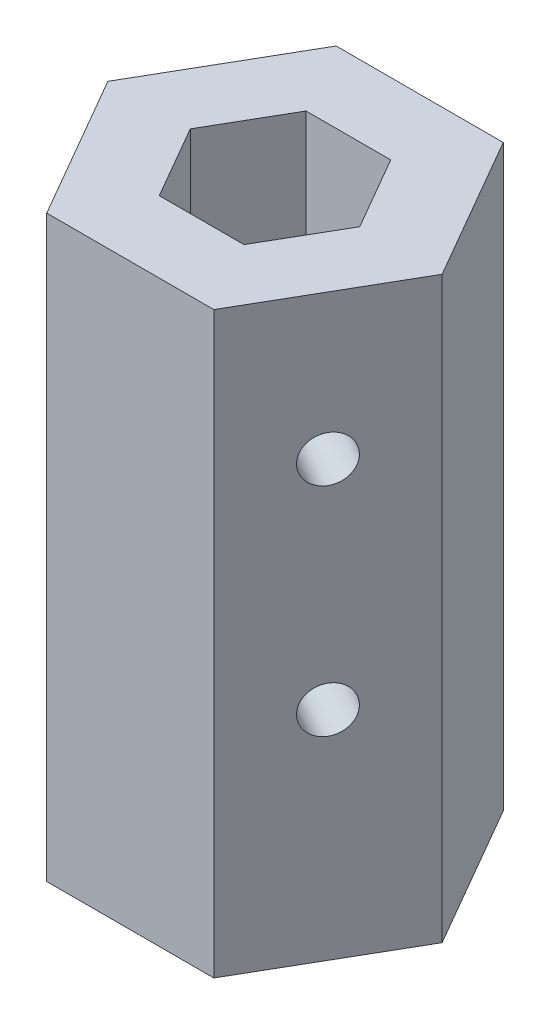
ISO-10303-21;
HEADER;
FILE_DESCRIPTION(('STEP AP214'),'2;1');
FILE_NAME('part.step','',(''),(''),'','','');
FILE_SCHEMA(('AUTOMOTIVE_DESIGN { 1 0 10303 214 1 1 1 1 }'));
ENDSEC;
DATA;
#1=APPLICATION_CONTEXT('core data for automotive mechanical design processes');
#2=APPLICATION_PROTOCOL_DEFINITION('international standard','automotive_design',2000,#1);
#3=PRODUCT_CONTEXT('',#1,'mechanical');
#4=PRODUCT('Part','Part','',(#3));
#5=PRODUCT_RELATED_PRODUCT_CATEGORY('part','',(#4));
#6=PRODUCT_DEFINITION_FORMATION('','',#4);
#7=PRODUCT_DEFINITION_CONTEXT('part definition',#1,'design');
#8=PRODUCT_DEFINITION('design','',#6,#7);
#9=PRODUCT_DEFINITION_SHAPE('','',#8);
#10=(LENGTH_UNIT() NAMED_UNIT(*) SI_UNIT(.MILLI.,.METRE.));
#11=(NAMED_UNIT(*) PLANE_ANGLE_UNIT() SI_UNIT($,.RADIAN.));
#12=(NAMED_UNIT(*) SI_UNIT($,.STERADIAN.) SOLID_ANGLE_UNIT());
#13=UNCERTAINTY_MEASURE_WITH_UNIT(LENGTH_MEASURE(1.E-05),#10,'distance_accuracy_value','');
#14=(GEOMETRIC_REPRESENTATION_CONTEXT(3) GLOBAL_UNCERTAINTY_ASSIGNED_CONTEXT((#13)) GLOBAL_UNIT_ASSIGNED_CONTEXT((#10,
#11,#12)) REPRESENTATION_CONTEXT('',''));
#15=CARTESIAN_POINT('',(0.,0.,0.));
#16=DIRECTION('',(0.,0.,1.));
#17=DIRECTION('',(1.,0.,0.));
#18=AXIS2_PLACEMENT_3D('',#15,#16,#17);
#19=CARTESIAN_POINT('',(0.,50.8,0.));
#20=DIRECTION('',(0.,1.,0.));
#21=DIRECTION('',(0.,0.,1.));
#22=AXIS2_PLACEMENT_3D('',#19,#20,#21);
#23=PLANE('',#22);
#24=DIRECTION('',(-0.5,0.,-0.866025403784438));
#25=VECTOR('',#24,1.);
#26=CARTESIAN_POINT('',(14.6646968374165,50.8,0.));
#27=LINE('',#26,#25);
#28=CARTESIAN_POINT('',(14.6646968374165,50.8,0.));
#29=VERTEX_POINT('',#28);
#30=CARTESIAN_POINT('',(7.33234841870825,50.8,-12.7));
#31=VERTEX_POINT('',#30);
#32=EDGE_CURVE('E203',#29,#31,#27,.T.);
#33=ORIENTED_EDGE('',*,*,#32,.T.);
#34=DIRECTION('',(-1.,0.,0.));
#35=VECTOR('',#34,1.);
#36=CARTESIAN_POINT('',(7.33234841870825,50.8,-12.7));
#37=LINE('',#36,#35);
#38=CARTESIAN_POINT('',(-7.33234841870825,50.8,-12.7));
#39=VERTEX_POINT('',#38);
#40=EDGE_CURVE('E207',#31,#39,#37,.T.);
#41=ORIENTED_EDGE('',*,*,#40,.T.);
#42=DIRECTION('',(-0.5,0.,0.866025403784439));
#43=VECTOR('',#42,1.);
#44=CARTESIAN_POINT('',(-7.33234841870825,50.8,-12.7));
#45=LINE('',#44,#43);
#46=CARTESIAN_POINT('',(-14.6646968374165,50.8,0.));
#47=VERTEX_POINT('',#46);
#48=EDGE_CURVE('E211',#39,#47,#45,.T.);
#49=ORIENTED_EDGE('',*,*,#48,.T.);
#50=DIRECTION('',(0.5,0.,0.866025403784439));
#51=VECTOR('',#50,1.);
#52=CARTESIAN_POINT('',(-14.6646968374165,50.8,0.));
#53=LINE('',#52,#51);
#54=CARTESIAN_POINT('',(-7.33234841870824,50.8,12.7));
#55=VERTEX_POINT('',#54);
#56=EDGE_CURVE('E214',#47,#55,#53,.T.);
#57=ORIENTED_EDGE('',*,*,#56,.T.);
#58=DIRECTION('',(1.,0.,0.));
#59=VECTOR('',#58,1.);
#60=CARTESIAN_POINT('',(-7.33234841870824,50.8,12.7));
#61=LINE('',#60,#59);
#62=CARTESIAN_POINT('',(7.33234841870825,50.8,12.7));
#63=VERTEX_POINT('',#62);
#64=EDGE_CURVE('E217',#55,#63,#61,.T.);
#65=ORIENTED_EDGE('',*,*,#64,.T.);
#66=DIRECTION('',(0.5,0.,-0.866025403784439));
#67=VECTOR('',#66,1.);
#68=CARTESIAN_POINT('',(7.33234841870825,50.8,12.7));
#69=LINE('',#68,#67);
#70=EDGE_CURVE('E220',#63,#29,#69,.T.);
#71=ORIENTED_EDGE('',*,*,#70,.T.);
#72=EDGE_LOOP('',(#33,#41,#49,#57,#65,#71));
#73=FACE_BOUND('',#72,.T.);
#74=DIRECTION('',(-1.,0.,0.));
#75=VECTOR('',#74,1.);
#76=CARTESIAN_POINT('',(3.71750064828508,50.8,-6.4389));
#77=LINE('',#76,#75);
#78=CARTESIAN_POINT('',(3.71750064828508,50.8,-6.4389));
#79=VERTEX_POINT('',#78);
#80=CARTESIAN_POINT('',(-3.71750064828508,50.8,-6.4389));
#81=VERTEX_POINT('',#80);
#82=EDGE_CURVE('E173',#79,#81,#77,.T.);
#83=ORIENTED_EDGE('',*,*,#82,.F.);
#84=DIRECTION('',(-0.5,0.,-0.866025403784438));
#85=VECTOR('',#84,1.);
#86=CARTESIAN_POINT('',(7.43500129657016,50.8,0.));
#87=LINE('',#86,#85);
#88=CARTESIAN_POINT('',(7.43500129657016,50.8,0.));
#89=VERTEX_POINT('',#88);
#90=EDGE_CURVE('E170',#89,#79,#87,.T.);
#91=ORIENTED_EDGE('',*,*,#90,.F.);
#92=DIRECTION('',(0.5,0.,-0.866025403784439));
#93=VECTOR('',#92,1.);
#94=CARTESIAN_POINT('',(3.71750064828508,50.8,6.4389));
#95=LINE('',#94,#93);
#96=CARTESIAN_POINT('',(3.71750064828508,50.8,6.4389));
#97=VERTEX_POINT('',#96);
#98=EDGE_CURVE('E140',#97,#89,#95,.T.);
#99=ORIENTED_EDGE('',*,*,#98,.F.);
#100=DIRECTION('',(1.,0.,0.));
#101=VECTOR('',#100,1.);
#102=CARTESIAN_POINT('',(-3.71750064828508,50.8,6.4389));
#103=LINE('',#102,#101);
#104=CARTESIAN_POINT('',(-3.71750064828508,50.8,6.4389));
#105=VERTEX_POINT('',#104);
#106=EDGE_CURVE('E182',#105,#97,#103,.T.);
#107=ORIENTED_EDGE('',*,*,#106,.F.);
#108=DIRECTION('',(0.5,0.,0.866025403784438));
#109=VECTOR('',#108,1.);
#110=CARTESIAN_POINT('',(-7.43500129657016,50.8,0.));
#111=LINE('',#110,#109);
#112=CARTESIAN_POINT('',(-7.43500129657016,50.8,0.));
#113=VERTEX_POINT('',#112);
#114=EDGE_CURVE('E179',#113,#105,#111,.T.);
#115=ORIENTED_EDGE('',*,*,#114,.F.);
#116=DIRECTION('',(-0.5,0.,0.866025403784439));
#117=VECTOR('',#116,1.);
#118=CARTESIAN_POINT('',(-3.71750064828508,50.8,-6.4389));
#119=LINE('',#118,#117);
#120=EDGE_CURVE('E176',#81,#113,#119,.T.);
#121=ORIENTED_EDGE('',*,*,#120,.F.);
#122=EDGE_LOOP('',(#83,#91,#99,#107,#115,#121));
#123=FACE_BOUND('',#122,.T.);
#124=ADVANCED_FACE('F39',(#73,#123),#23,.T.);
#125=CARTESIAN_POINT('',(0.,0.,0.));
#126=DIRECTION('',(0.,1.,0.));
#127=DIRECTION('',(0.,0.,1.));
#128=AXIS2_PLACEMENT_3D('',#125,#126,#127);
#129=PLANE('',#128);
#130=DIRECTION('',(-0.5,0.,-0.866025403784438));
#131=VECTOR('',#130,1.);
#132=CARTESIAN_POINT('',(14.6646968374165,0.,0.));
#133=LINE('',#132,#131);
#134=CARTESIAN_POINT('',(14.6646968374165,0.,0.));
#135=VERTEX_POINT('',#134);
#136=CARTESIAN_POINT('',(7.33234841870825,0.,-12.7));
#137=VERTEX_POINT('',#136);
#138=EDGE_CURVE('E202',#135,#137,#133,.T.);
#139=ORIENTED_EDGE('',*,*,#138,.F.);
#140=DIRECTION('',(0.5,0.,-0.866025403784439));
#141=VECTOR('',#140,1.);
#142=CARTESIAN_POINT('',(7.33234841870825,0.,12.7));
#143=LINE('',#142,#141);
#144=CARTESIAN_POINT('',(7.33234841870825,0.,12.7));
#145=VERTEX_POINT('',#144);
#146=EDGE_CURVE('E208',#145,#135,#143,.T.);
#147=ORIENTED_EDGE('',*,*,#146,.F.);
#148=DIRECTION('',(1.,0.,0.));
#149=VECTOR('',#148,1.);
#150=CARTESIAN_POINT('',(-7.33234841870824,0.,12.7));
#151=LINE('',#150,#149);
#152=CARTESIAN_POINT('',(-7.33234841870824,0.,12.7));
#153=VERTEX_POINT('',#152);
#154=EDGE_CURVE('E236',#153,#145,#151,.T.);
#155=ORIENTED_EDGE('',*,*,#154,.F.);
#156=DIRECTION('',(0.5,0.,0.866025403784439));
#157=VECTOR('',#156,1.);
#158=CARTESIAN_POINT('',(-14.6646968374165,0.,0.));
#159=LINE('',#158,#157);
#160=CARTESIAN_POINT('',(-14.6646968374165,0.,0.));
#161=VERTEX_POINT('',#160);
#162=EDGE_CURVE('E233',#161,#153,#159,.T.);
#163=ORIENTED_EDGE('',*,*,#162,.F.);
#164=DIRECTION('',(-0.5,0.,0.866025403784439));
#165=VECTOR('',#164,1.);
#166=CARTESIAN_POINT('',(-7.33234841870825,0.,-12.7));
#167=LINE('',#166,#165);
#168=CARTESIAN_POINT('',(-7.33234841870825,0.,-12.7));
#169=VERTEX_POINT('',#168);
#170=EDGE_CURVE('E230',#169,#161,#167,.T.);
#171=ORIENTED_EDGE('',*,*,#170,.F.);
#172=DIRECTION('',(-1.,0.,0.));
#173=VECTOR('',#172,1.);
#174=CARTESIAN_POINT('',(7.33234841870825,0.,-12.7));
#175=LINE('',#174,#173);
#176=EDGE_CURVE('E227',#137,#169,#175,.T.);
#177=ORIENTED_EDGE('',*,*,#176,.F.);
#178=EDGE_LOOP('',(#139,#147,#155,#163,#171,#177));
#179=FACE_BOUND('',#178,.T.);
#180=ADVANCED_FACE('F328',(#179),#129,.F.);
#181=CARTESIAN_POINT('',(14.6646968374165,50.8,0.));
#182=DIRECTION('',(-0.866025403784438,0.,0.5));
#183=DIRECTION('',(0.5,0.,0.866025403784439));
#184=AXIS2_PLACEMENT_3D('',#181,#182,#183);
#185=PLANE('',#184);
#186=ORIENTED_EDGE('',*,*,#138,.T.);
#187=DIRECTION('',(0.,-1.,0.));
#188=VECTOR('',#187,1.);
#189=CARTESIAN_POINT('',(7.33234841870825,50.8,-12.7));
#190=LINE('',#189,#188);
#191=EDGE_CURVE('E11',#31,#137,#190,.T.);
#192=ORIENTED_EDGE('',*,*,#191,.F.);
#193=ORIENTED_EDGE('',*,*,#32,.F.);
#194=DIRECTION('',(0.,-1.,0.));
#195=VECTOR('',#194,1.);
#196=CARTESIAN_POINT('',(14.6646968374165,50.8,0.));
#197=LINE('',#196,#195);
#198=EDGE_CURVE('E223',#29,#135,#197,.T.);
#199=ORIENTED_EDGE('',*,*,#198,.T.);
#200=EDGE_LOOP('',(#186,#192,#193,#199));
#201=FACE_BOUND('',#200,.T.);
#202=ADVANCED_FACE('F41',(#201),#185,.F.);
#203=CARTESIAN_POINT('',(7.33234841870825,50.8,-12.7));
#204=DIRECTION('',(0.,0.,1.));
#205=DIRECTION('',(1.,0.,0.));
#206=AXIS2_PLACEMENT_3D('',#203,#204,#205);
#207=PLANE('',#206);
#208=ORIENTED_EDGE('',*,*,#176,.T.);
#209=DIRECTION('',(0.,-1.,0.));
#210=VECTOR('',#209,1.);
#211=CARTESIAN_POINT('',(-7.33234841870825,50.8,-12.7));
#212=LINE('',#211,#210);
#213=EDGE_CURVE('E49',#39,#169,#212,.T.);
#214=ORIENTED_EDGE('',*,*,#213,.F.);
#215=ORIENTED_EDGE('',*,*,#40,.F.);
#216=ORIENTED_EDGE('',*,*,#191,.T.);
#217=EDGE_LOOP('',(#208,#214,#215,#216));
#218=FACE_BOUND('',#217,.T.);
#219=ADVANCED_FACE('F314',(#218),#207,.F.);
#220=CARTESIAN_POINT('',(-7.33234841870825,50.8,-12.7));
#221=DIRECTION('',(0.866025403784439,0.,0.5));
#222=DIRECTION('',(0.5,0.,-0.866025403784439));
#223=AXIS2_PLACEMENT_3D('',#220,#221,#222);
#224=PLANE('',#223);
#225=CARTESIAN_POINT('',(-10.9985226280624,38.1,-6.35));
#226=DIRECTION('',(0.866025403784439,0.,0.5));
#227=DIRECTION('',(0.5,0.,-0.866025403784439));
#228=AXIS2_PLACEMENT_3D('',#225,#226,#227);
#229=CIRCLE('',#228,2.6289);
#230=CARTESIAN_POINT('',(-9.68407262806237,38.1,-8.62669418400891));
#231=VERTEX_POINT('',#230);
#232=EDGE_CURVE('E274',#231,#231,#229,.T.);
#233=ORIENTED_EDGE('',*,*,#232,.T.);
#234=EDGE_LOOP('',(#233));
#235=FACE_BOUND('',#234,.T.);
#236=CARTESIAN_POINT('',(-10.9985226280624,19.05,-6.35));
#237=DIRECTION('',(0.866025403784439,0.,0.5));
#238=DIRECTION('',(0.5,0.,-0.866025403784439));
#239=AXIS2_PLACEMENT_3D('',#236,#237,#238);
#240=CIRCLE('',#239,2.6289);
#241=CARTESIAN_POINT('',(-9.68407262806237,19.05,-8.62669418400891));
#242=VERTEX_POINT('',#241);
#243=EDGE_CURVE('E279',#242,#242,#240,.T.);
#244=ORIENTED_EDGE('',*,*,#243,.T.);
#245=EDGE_LOOP('',(#244));
#246=FACE_BOUND('',#245,.T.);
#247=ORIENTED_EDGE('',*,*,#170,.T.);
#248=DIRECTION('',(0.,-1.,0.));
#249=VECTOR('',#248,1.);
#250=CARTESIAN_POINT('',(-14.6646968374165,50.8,0.));
#251=LINE('',#250,#249);
#252=EDGE_CURVE('E252',#47,#161,#251,.T.);
#253=ORIENTED_EDGE('',*,*,#252,.F.);
#254=ORIENTED_EDGE('',*,*,#48,.F.);
#255=ORIENTED_EDGE('',*,*,#213,.T.);
#256=EDGE_LOOP('',(#247,#253,#254,#255));
#257=FACE_BOUND('',#256,.T.);
#258=ADVANCED_FACE('F310',(#235,#246,#257),#224,.F.);
#259=CARTESIAN_POINT('',(-14.6646968374165,50.8,0.));
#260=DIRECTION('',(0.866025403784439,0.,-0.5));
#261=DIRECTION('',(-0.5,0.,-0.866025403784439));
#262=AXIS2_PLACEMENT_3D('',#259,#260,#261);
#263=PLANE('',#262);
#264=ORIENTED_EDGE('',*,*,#162,.T.);
#265=DIRECTION('',(0.,-1.,0.));
#266=VECTOR('',#265,1.);
#267=CARTESIAN_POINT('',(-7.33234841870824,50.8,12.7));
#268=LINE('',#267,#266);
#269=EDGE_CURVE('E248',#55,#153,#268,.T.);
#270=ORIENTED_EDGE('',*,*,#269,.F.);
#271=ORIENTED_EDGE('',*,*,#56,.F.);
#272=ORIENTED_EDGE('',*,*,#252,.T.);
#273=EDGE_LOOP('',(#264,#270,#271,#272));
#274=FACE_BOUND('',#273,.T.);
#275=ADVANCED_FACE('F313',(#274),#263,.F.);
#276=CARTESIAN_POINT('',(-7.33234841870824,50.8,12.7));
#277=DIRECTION('',(0.,0.,-1.));
#278=DIRECTION('',(-1.,0.,0.));
#279=AXIS2_PLACEMENT_3D('',#276,#277,#278);
#280=PLANE('',#279);
#281=ORIENTED_EDGE('',*,*,#154,.T.);
#282=DIRECTION('',(0.,-1.,0.));
#283=VECTOR('',#282,1.);
#284=CARTESIAN_POINT('',(7.33234841870825,50.8,12.7));
#285=LINE('',#284,#283);
#286=EDGE_CURVE('E244',#63,#145,#285,.T.);
#287=ORIENTED_EDGE('',*,*,#286,.F.);
#288=ORIENTED_EDGE('',*,*,#64,.F.);
#289=ORIENTED_EDGE('',*,*,#269,.T.);
#290=EDGE_LOOP('',(#281,#287,#288,#289));
#291=FACE_BOUND('',#290,.T.);
#292=ADVANCED_FACE('F332',(#291),#280,.F.);
#293=CARTESIAN_POINT('',(7.33234841870825,50.8,12.7));
#294=DIRECTION('',(-0.866025403784439,0.,-0.5));
#295=DIRECTION('',(-0.5,0.,0.866025403784439));
#296=AXIS2_PLACEMENT_3D('',#293,#294,#295);
#297=PLANE('',#296);
#298=CARTESIAN_POINT('',(10.9985226280624,19.05,6.35));
#299=DIRECTION('',(0.866025403784439,0.,0.5));
#300=DIRECTION('',(0.5,0.,-0.866025403784439));
#301=AXIS2_PLACEMENT_3D('',#298,#299,#300);
#302=CIRCLE('',#301,2.0193);
#303=CARTESIAN_POINT('',(12.0081726280624,19.05,4.60123490213809));
#304=VERTEX_POINT('',#303);
#305=EDGE_CURVE('E261',#304,#304,#302,.T.);
#306=ORIENTED_EDGE('',*,*,#305,.F.);
#307=EDGE_LOOP('',(#306));
#308=FACE_BOUND('',#307,.T.);
#309=CARTESIAN_POINT('',(10.9985226280624,38.1,6.35));
#310=DIRECTION('',(0.866025403784439,0.,0.5));
#311=DIRECTION('',(0.5,0.,-0.866025403784439));
#312=AXIS2_PLACEMENT_3D('',#309,#310,#311);
#313=CIRCLE('',#312,2.0193);
#314=CARTESIAN_POINT('',(12.0081726280624,38.1,4.60123490213809));
#315=VERTEX_POINT('',#314);
#316=EDGE_CURVE('E268',#315,#315,#313,.T.);
#317=ORIENTED_EDGE('',*,*,#316,.F.);
#318=EDGE_LOOP('',(#317));
#319=FACE_BOUND('',#318,.T.);
#320=ORIENTED_EDGE('',*,*,#146,.T.);
#321=ORIENTED_EDGE('',*,*,#198,.F.);
#322=ORIENTED_EDGE('',*,*,#70,.F.);
#323=ORIENTED_EDGE('',*,*,#286,.T.);
#324=EDGE_LOOP('',(#320,#321,#322,#323));
#325=FACE_BOUND('',#324,.T.);
#326=ADVANCED_FACE('F336',(#308,#319,#325),#297,.F.);
#327=CARTESIAN_POINT('',(7.43500129657016,50.8,0.));
#328=DIRECTION('',(-0.866025403784438,0.,0.5));
#329=DIRECTION('',(0.5,0.,0.866025403784439));
#330=AXIS2_PLACEMENT_3D('',#327,#328,#329);
#331=PLANE('',#330);
#332=DIRECTION('',(0.5,0.,0.866025403784439));
#333=VECTOR('',#332,1.);
#334=CARTESIAN_POINT('',(7.43500129657016,6.35,0.));
#335=LINE('',#334,#333);
#336=CARTESIAN_POINT('',(3.71750064828508,6.35,-6.4389));
#337=VERTEX_POINT('',#336);
#338=CARTESIAN_POINT('',(7.43500129657016,6.35,0.));
#339=VERTEX_POINT('',#338);
#340=EDGE_CURVE('E147',#337,#339,#335,.T.);
#341=ORIENTED_EDGE('',*,*,#340,.T.);
#342=DIRECTION('',(0.,-1.,0.));
#343=VECTOR('',#342,1.);
#344=CARTESIAN_POINT('',(7.43500129657016,50.8,0.));
#345=LINE('',#344,#343);
#346=EDGE_CURVE('E133',#89,#339,#345,.T.);
#347=ORIENTED_EDGE('',*,*,#346,.F.);
#348=ORIENTED_EDGE('',*,*,#90,.T.);
#349=DIRECTION('',(0.,-1.,0.));
#350=VECTOR('',#349,1.);
#351=CARTESIAN_POINT('',(3.71750064828508,50.8,-6.4389));
#352=LINE('',#351,#350);
#353=EDGE_CURVE('E149',#79,#337,#352,.T.);
#354=ORIENTED_EDGE('',*,*,#353,.T.);
#355=EDGE_LOOP('',(#341,#347,#348,#354));
#356=FACE_BOUND('',#355,.T.);
#357=ADVANCED_FACE('F148',(#356),#331,.T.);
#358=CARTESIAN_POINT('',(3.71750064828508,50.8,-6.4389));
#359=DIRECTION('',(0.,0.,1.));
#360=DIRECTION('',(1.,0.,0.));
#361=AXIS2_PLACEMENT_3D('',#358,#359,#360);
#362=PLANE('',#361);
#363=DIRECTION('',(1.,0.,0.));
#364=VECTOR('',#363,1.);
#365=CARTESIAN_POINT('',(3.71750064828508,6.35,-6.4389));
#366=LINE('',#365,#364);
#367=CARTESIAN_POINT('',(-3.71750064828508,6.35,-6.4389));
#368=VERTEX_POINT('',#367);
#369=EDGE_CURVE('E57',#368,#337,#366,.T.);
#370=ORIENTED_EDGE('',*,*,#369,.T.);
#371=ORIENTED_EDGE('',*,*,#353,.F.);
#372=ORIENTED_EDGE('',*,*,#82,.T.);
#373=DIRECTION('',(0.,-1.,0.));
#374=VECTOR('',#373,1.);
#375=CARTESIAN_POINT('',(-3.71750064828508,50.8,-6.4389));
#376=LINE('',#375,#374);
#377=EDGE_CURVE('E197',#81,#368,#376,.T.);
#378=ORIENTED_EDGE('',*,*,#377,.T.);
#379=EDGE_LOOP('',(#370,#371,#372,#378));
#380=FACE_BOUND('',#379,.T.);
#381=ADVANCED_FACE('F299',(#380),#362,.T.);
#382=CARTESIAN_POINT('',(-3.71750064828508,50.8,-6.4389));
#383=DIRECTION('',(0.866025403784439,0.,0.5));
#384=DIRECTION('',(0.5,0.,-0.866025403784439));
#385=AXIS2_PLACEMENT_3D('',#382,#383,#384);
#386=PLANE('',#385);
#387=CARTESIAN_POINT('',(-5.57625097242762,38.1,-3.21945));
#388=DIRECTION('',(0.866025403784439,0.,0.5));
#389=DIRECTION('',(0.5,0.,-0.866025403784439));
#390=AXIS2_PLACEMENT_3D('',#387,#388,#389);
#391=CIRCLE('',#390,2.6289);
#392=CARTESIAN_POINT('',(-4.26180097242762,38.1,-5.49614418400891));
#393=VERTEX_POINT('',#392);
#394=EDGE_CURVE('E283',#393,#393,#391,.T.);
#395=ORIENTED_EDGE('',*,*,#394,.F.);
#396=EDGE_LOOP('',(#395));
#397=FACE_BOUND('',#396,.T.);
#398=CARTESIAN_POINT('',(-5.57625097242762,19.05,-3.21945));
#399=DIRECTION('',(0.866025403784439,0.,0.5));
#400=DIRECTION('',(0.5,0.,-0.866025403784439));
#401=AXIS2_PLACEMENT_3D('',#398,#399,#400);
#402=CIRCLE('',#401,2.6289);
#403=CARTESIAN_POINT('',(-4.26180097242762,19.05,-5.49614418400891));
#404=VERTEX_POINT('',#403);
#405=EDGE_CURVE('E284',#404,#404,#402,.T.);
#406=ORIENTED_EDGE('',*,*,#405,.F.);
#407=EDGE_LOOP('',(#406));
#408=FACE_BOUND('',#407,.T.);
#409=DIRECTION('',(0.5,0.,-0.866025403784439));
#410=VECTOR('',#409,1.);
#411=CARTESIAN_POINT('',(-3.71750064828508,6.35,-6.4389));
#412=LINE('',#411,#410);
#413=CARTESIAN_POINT('',(-7.43500129657016,6.35,0.));
#414=VERTEX_POINT('',#413);
#415=EDGE_CURVE('E65',#414,#368,#412,.T.);
#416=ORIENTED_EDGE('',*,*,#415,.T.);
#417=ORIENTED_EDGE('',*,*,#377,.F.);
#418=ORIENTED_EDGE('',*,*,#120,.T.);
#419=DIRECTION('',(0.,-1.,0.));
#420=VECTOR('',#419,1.);
#421=CARTESIAN_POINT('',(-7.43500129657016,50.8,0.));
#422=LINE('',#421,#420);
#423=EDGE_CURVE('E194',#113,#414,#422,.T.);
#424=ORIENTED_EDGE('',*,*,#423,.T.);
#425=EDGE_LOOP('',(#416,#417,#418,#424));
#426=FACE_BOUND('',#425,.T.);
#427=ADVANCED_FACE('F295',(#397,#408,#426),#386,.T.);
#428=CARTESIAN_POINT('',(-7.43500129657016,50.8,0.));
#429=DIRECTION('',(0.866025403784438,0.,-0.5));
#430=DIRECTION('',(-0.5,0.,-0.866025403784439));
#431=AXIS2_PLACEMENT_3D('',#428,#429,#430);
#432=PLANE('',#431);
#433=DIRECTION('',(-0.5,0.,-0.866025403784438));
#434=VECTOR('',#433,1.);
#435=CARTESIAN_POINT('',(-7.43500129657016,6.35,0.));
#436=LINE('',#435,#434);
#437=CARTESIAN_POINT('',(-3.71750064828508,6.35,6.4389));
#438=VERTEX_POINT('',#437);
#439=EDGE_CURVE('E160',#438,#414,#436,.T.);
#440=ORIENTED_EDGE('',*,*,#439,.T.);
#441=ORIENTED_EDGE('',*,*,#423,.F.);
#442=ORIENTED_EDGE('',*,*,#114,.T.);
#443=DIRECTION('',(0.,-1.,0.));
#444=VECTOR('',#443,1.);
#445=CARTESIAN_POINT('',(-3.71750064828508,50.8,6.4389));
#446=LINE('',#445,#444);
#447=EDGE_CURVE('E190',#105,#438,#446,.T.);
#448=ORIENTED_EDGE('',*,*,#447,.T.);
#449=EDGE_LOOP('',(#440,#441,#442,#448));
#450=FACE_BOUND('',#449,.T.);
#451=ADVANCED_FACE('F298',(#450),#432,.T.);
#452=CARTESIAN_POINT('',(-3.71750064828508,50.8,6.4389));
#453=DIRECTION('',(0.,0.,-1.));
#454=DIRECTION('',(-1.,0.,0.));
#455=AXIS2_PLACEMENT_3D('',#452,#453,#454);
#456=PLANE('',#455);
#457=DIRECTION('',(-1.,0.,0.));
#458=VECTOR('',#457,1.);
#459=CARTESIAN_POINT('',(-3.71750064828508,6.35,6.4389));
#460=LINE('',#459,#458);
#461=CARTESIAN_POINT('',(3.71750064828508,6.35,6.4389));
#462=VERTEX_POINT('',#461);
#463=EDGE_CURVE('E156',#462,#438,#460,.T.);
#464=ORIENTED_EDGE('',*,*,#463,.T.);
#465=ORIENTED_EDGE('',*,*,#447,.F.);
#466=ORIENTED_EDGE('',*,*,#106,.T.);
#467=DIRECTION('',(0.,-1.,0.));
#468=VECTOR('',#467,1.);
#469=CARTESIAN_POINT('',(3.71750064828508,50.8,6.4389));
#470=LINE('',#469,#468);
#471=EDGE_CURVE('E144',#97,#462,#470,.T.);
#472=ORIENTED_EDGE('',*,*,#471,.T.);
#473=EDGE_LOOP('',(#464,#465,#466,#472));
#474=FACE_BOUND('',#473,.T.);
#475=ADVANCED_FACE('F400',(#474),#456,.T.);
#476=CARTESIAN_POINT('',(3.71750064828508,50.8,6.4389));
#477=DIRECTION('',(-0.866025403784439,0.,-0.5));
#478=DIRECTION('',(-0.5,0.,0.866025403784439));
#479=AXIS2_PLACEMENT_3D('',#476,#477,#478);
#480=PLANE('',#479);
#481=CARTESIAN_POINT('',(5.57625097242762,19.05,3.21945));
#482=DIRECTION('',(-0.866025403784439,0.,-0.5));
#483=DIRECTION('',(-0.5,0.,0.866025403784439));
#484=AXIS2_PLACEMENT_3D('',#481,#482,#483);
#485=CIRCLE('',#484,2.0193);
#486=CARTESIAN_POINT('',(4.56660097242762,19.05,4.96821509786192));
#487=VERTEX_POINT('',#486);
#488=EDGE_CURVE('E43',#487,#487,#485,.T.);
#489=ORIENTED_EDGE('',*,*,#488,.F.);
#490=EDGE_LOOP('',(#489));
#491=FACE_BOUND('',#490,.T.);
#492=CARTESIAN_POINT('',(5.57625097242762,38.1,3.21945));
#493=DIRECTION('',(-0.866025403784439,0.,-0.5));
#494=DIRECTION('',(-0.5,0.,0.866025403784439));
#495=AXIS2_PLACEMENT_3D('',#492,#493,#494);
#496=CIRCLE('',#495,2.0193);
#497=CARTESIAN_POINT('',(4.56660097242762,38.1,4.96821509786191));
#498=VERTEX_POINT('',#497);
#499=EDGE_CURVE('E258',#498,#498,#496,.T.);
#500=ORIENTED_EDGE('',*,*,#499,.F.);
#501=EDGE_LOOP('',(#500));
#502=FACE_BOUND('',#501,.T.);
#503=DIRECTION('',(-0.5,0.,0.866025403784439));
#504=VECTOR('',#503,1.);
#505=CARTESIAN_POINT('',(3.71750064828508,6.35,6.4389));
#506=LINE('',#505,#504);
#507=EDGE_CURVE('E137',#339,#462,#506,.T.);
#508=ORIENTED_EDGE('',*,*,#507,.T.);
#509=ORIENTED_EDGE('',*,*,#471,.F.);
#510=ORIENTED_EDGE('',*,*,#98,.T.);
#511=ORIENTED_EDGE('',*,*,#346,.T.);
#512=EDGE_LOOP('',(#508,#509,#510,#511));
#513=FACE_BOUND('',#512,.T.);
#514=ADVANCED_FACE('F135',(#491,#502,#513),#480,.T.);
#515=CARTESIAN_POINT('',(0.,6.35,0.));
#516=DIRECTION('',(0.,1.,0.));
#517=DIRECTION('',(0.,0.,1.));
#518=AXIS2_PLACEMENT_3D('',#515,#516,#517);
#519=PLANE('',#518);
#520=ORIENTED_EDGE('',*,*,#340,.F.);
#521=ORIENTED_EDGE('',*,*,#369,.F.);
#522=ORIENTED_EDGE('',*,*,#415,.F.);
#523=ORIENTED_EDGE('',*,*,#439,.F.);
#524=ORIENTED_EDGE('',*,*,#463,.F.);
#525=ORIENTED_EDGE('',*,*,#507,.F.);
#526=EDGE_LOOP('',(#520,#521,#522,#523,#524,#525));
#527=FACE_BOUND('',#526,.T.);
#528=ADVANCED_FACE('F154',(#527),#519,.T.);
#529=CARTESIAN_POINT('',(-16.4977839420936,38.1,-9.52500000000001));
#530=DIRECTION('',(0.866025403784439,0.,0.5));
#531=DIRECTION('',(0.5,0.,-0.866025403784439));
#532=AXIS2_PLACEMENT_3D('',#529,#530,#531);
#533=CYLINDRICAL_SURFACE('',#532,2.0193);
#534=ORIENTED_EDGE('',*,*,#499,.T.);
#535=EDGE_LOOP('',(#534));
#536=FACE_BOUND('',#535,.T.);
#537=ORIENTED_EDGE('',*,*,#316,.T.);
#538=EDGE_LOOP('',(#537));
#539=FACE_BOUND('',#538,.T.);
#540=ADVANCED_FACE('F421',(#536,#539),#533,.F.);
#541=CARTESIAN_POINT('',(-16.4977839420936,19.05,-9.52500000000001));
#542=DIRECTION('',(0.866025403784439,0.,0.5));
#543=DIRECTION('',(0.5,0.,-0.866025403784439));
#544=AXIS2_PLACEMENT_3D('',#541,#542,#543);
#545=CYLINDRICAL_SURFACE('',#544,2.0193);
#546=ORIENTED_EDGE('',*,*,#488,.T.);
#547=EDGE_LOOP('',(#546));
#548=FACE_BOUND('',#547,.T.);
#549=ORIENTED_EDGE('',*,*,#305,.T.);
#550=EDGE_LOOP('',(#549));
#551=FACE_BOUND('',#550,.T.);
#552=ADVANCED_FACE('F306',(#548,#551),#545,.F.);
#553=CARTESIAN_POINT('',(-16.4977839420936,19.05,-9.525));
#554=DIRECTION('',(0.866025403784439,0.,0.5));
#555=DIRECTION('',(0.5,0.,-0.866025403784439));
#556=AXIS2_PLACEMENT_3D('',#553,#554,#555);
#557=CYLINDRICAL_SURFACE('',#556,2.6289);
#558=ORIENTED_EDGE('',*,*,#405,.T.);
#559=EDGE_LOOP('',(#558));
#560=FACE_BOUND('',#559,.T.);
#561=ORIENTED_EDGE('',*,*,#243,.F.);
#562=EDGE_LOOP('',(#561));
#563=FACE_BOUND('',#562,.T.);
#564=ADVANCED_FACE('F303',(#560,#563),#557,.F.);
#565=CARTESIAN_POINT('',(-16.4977839420936,38.1,-9.525));
#566=DIRECTION('',(0.866025403784439,0.,0.5));
#567=DIRECTION('',(0.5,0.,-0.866025403784439));
#568=AXIS2_PLACEMENT_3D('',#565,#566,#567);
#569=CYLINDRICAL_SURFACE('',#568,2.6289);
#570=ORIENTED_EDGE('',*,*,#394,.T.);
#571=EDGE_LOOP('',(#570));
#572=FACE_BOUND('',#571,.T.);
#573=ORIENTED_EDGE('',*,*,#232,.F.);
#574=EDGE_LOOP('',(#573));
#575=FACE_BOUND('',#574,.T.);
#576=ADVANCED_FACE('F292',(#572,#575),#569,.F.);
#577=CLOSED_SHELL('',(#124,#180,#202,#219,#258,#275,#292,#326,#357,#381,#427,#451,#475,#514,
#528,#540,#552,#564,#576));
#578=MANIFOLD_SOLID_BREP('B2',#577);
#579=ADVANCED_BREP_SHAPE_REPRESENTATION('',(#18,#578),#14);
#580=SHAPE_DEFINITION_REPRESENTATION(#9,#579);
ENDSEC;
END-ISO-10303-21;
